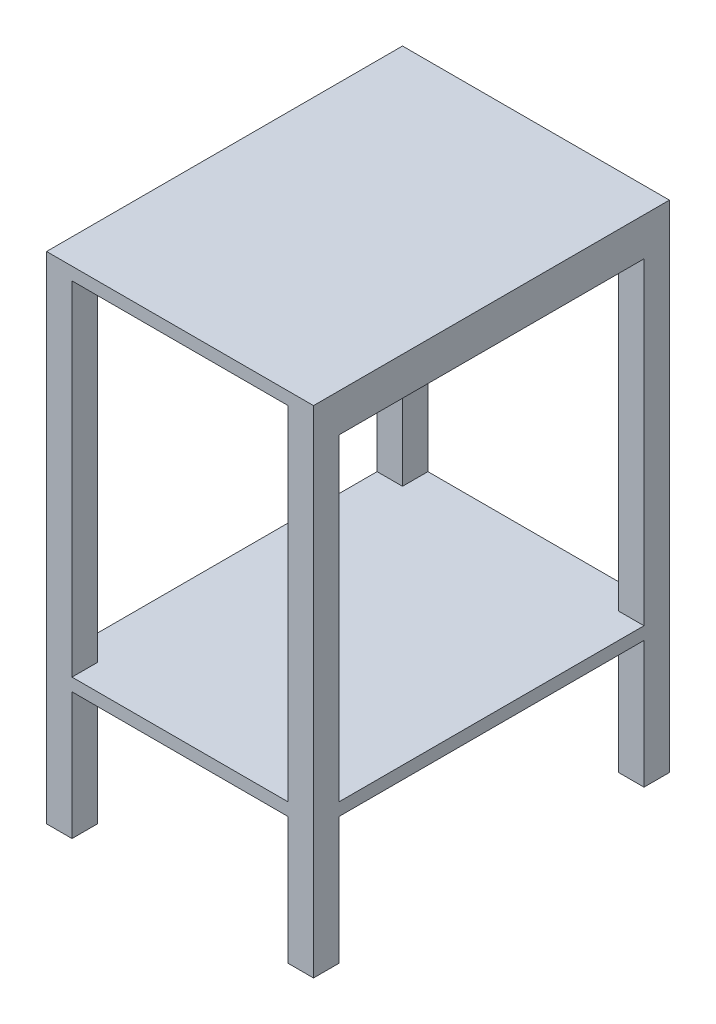
ISO-10303-21;
HEADER;
FILE_DESCRIPTION(('STEP AP214'),'2;1');
FILE_NAME('part.step','',(''),(''),'','','');
FILE_SCHEMA(('AUTOMOTIVE_DESIGN { 1 0 10303 214 1 1 1 1 }'));
ENDSEC;
DATA;
#1=APPLICATION_CONTEXT('core data for automotive mechanical design processes');
#2=APPLICATION_PROTOCOL_DEFINITION('international standard','automotive_design',2000,#1);
#3=PRODUCT_CONTEXT('',#1,'mechanical');
#4=PRODUCT('Part','Part','',(#3));
#5=PRODUCT_RELATED_PRODUCT_CATEGORY('part','',(#4));
#6=PRODUCT_DEFINITION_FORMATION('','',#4);
#7=PRODUCT_DEFINITION_CONTEXT('part definition',#1,'design');
#8=PRODUCT_DEFINITION('design','',#6,#7);
#9=PRODUCT_DEFINITION_SHAPE('','',#8);
#10=(LENGTH_UNIT() NAMED_UNIT(*) SI_UNIT(.MILLI.,.METRE.));
#11=(NAMED_UNIT(*) PLANE_ANGLE_UNIT() SI_UNIT($,.RADIAN.));
#12=(NAMED_UNIT(*) SI_UNIT($,.STERADIAN.) SOLID_ANGLE_UNIT());
#13=UNCERTAINTY_MEASURE_WITH_UNIT(LENGTH_MEASURE(1.E-05),#10,'distance_accuracy_value','');
#14=(GEOMETRIC_REPRESENTATION_CONTEXT(3) GLOBAL_UNCERTAINTY_ASSIGNED_CONTEXT((#13)) GLOBAL_UNIT_ASSIGNED_CONTEXT((#10,
#11,#12)) REPRESENTATION_CONTEXT('',''));
#15=CARTESIAN_POINT('',(0.,0.,0.));
#16=DIRECTION('',(0.,0.,1.));
#17=DIRECTION('',(1.,0.,0.));
#18=AXIS2_PLACEMENT_3D('',#15,#16,#17);
#19=CARTESIAN_POINT('',(0.,0.,0.));
#20=DIRECTION('',(0.,-1.,0.));
#21=DIRECTION('',(0.,0.,-1.));
#22=AXIS2_PLACEMENT_3D('',#19,#20,#21);
#23=PLANE('',#22);
#24=DIRECTION('',(0.,0.,1.));
#25=VECTOR('',#24,1.);
#26=CARTESIAN_POINT('',(85.0000000000001,0.,-160.));
#27=LINE('',#26,#25);
#28=CARTESIAN_POINT('',(85.0000000000001,0.,-140.));
#29=VERTEX_POINT('',#28);
#30=CARTESIAN_POINT('',(85.0000000000001,0.,-120.));
#31=VERTEX_POINT('',#30);
#32=EDGE_CURVE('E262',#29,#31,#27,.T.);
#33=ORIENTED_EDGE('',*,*,#32,.F.);
#34=DIRECTION('',(-1.,0.,0.));
#35=VECTOR('',#34,1.);
#36=CARTESIAN_POINT('',(-105.,0.,-140.));
#37=LINE('',#36,#35);
#38=CARTESIAN_POINT('',(105.,0.,-140.));
#39=VERTEX_POINT('',#38);
#40=EDGE_CURVE('E433',#39,#29,#37,.T.);
#41=ORIENTED_EDGE('',*,*,#40,.F.);
#42=DIRECTION('',(0.,0.,-1.));
#43=VECTOR('',#42,1.);
#44=CARTESIAN_POINT('',(105.,0.,140.));
#45=LINE('',#44,#43);
#46=CARTESIAN_POINT('',(105.,0.,-120.));
#47=VERTEX_POINT('',#46);
#48=EDGE_CURVE('E412',#47,#39,#45,.T.);
#49=ORIENTED_EDGE('',*,*,#48,.F.);
#50=DIRECTION('',(1.,0.,0.));
#51=VECTOR('',#50,1.);
#52=CARTESIAN_POINT('',(0.,0.,-120.));
#53=LINE('',#52,#51);
#54=EDGE_CURVE('E465',#31,#47,#53,.T.);
#55=ORIENTED_EDGE('',*,*,#54,.F.);
#56=EDGE_LOOP('',(#33,#41,#49,#55));
#57=FACE_BOUND('',#56,.T.);
#58=ADVANCED_FACE('F43',(#57),#23,.T.);
#59=CARTESIAN_POINT('',(85.0000000000001,0.,120.));
#60=VERTEX_POINT('',#59);
#61=CARTESIAN_POINT('',(85.0000000000001,0.,140.));
#62=VERTEX_POINT('',#61);
#63=EDGE_CURVE('E248',#60,#62,#27,.T.);
#64=ORIENTED_EDGE('',*,*,#63,.F.);
#65=DIRECTION('',(-1.,0.,0.));
#66=VECTOR('',#65,1.);
#67=CARTESIAN_POINT('',(0.,0.,120.));
#68=LINE('',#67,#66);
#69=CARTESIAN_POINT('',(105.,0.,120.));
#70=VERTEX_POINT('',#69);
#71=EDGE_CURVE('E461',#70,#60,#68,.T.);
#72=ORIENTED_EDGE('',*,*,#71,.F.);
#73=CARTESIAN_POINT('',(105.,0.,140.));
#74=VERTEX_POINT('',#73);
#75=EDGE_CURVE('E428',#74,#70,#45,.T.);
#76=ORIENTED_EDGE('',*,*,#75,.F.);
#77=DIRECTION('',(1.,0.,0.));
#78=VECTOR('',#77,1.);
#79=CARTESIAN_POINT('',(-105.,0.,140.));
#80=LINE('',#79,#78);
#81=EDGE_CURVE('E442',#62,#74,#80,.T.);
#82=ORIENTED_EDGE('',*,*,#81,.F.);
#83=EDGE_LOOP('',(#64,#72,#76,#82));
#84=FACE_BOUND('',#83,.T.);
#85=ADVANCED_FACE('F546',(#84),#23,.T.);
#86=CARTESIAN_POINT('',(-195.,0.,-120.));
#87=DIRECTION('',(0.,0.,-1.));
#88=DIRECTION('',(-1.,0.,0.));
#89=AXIS2_PLACEMENT_3D('',#86,#87,#88);
#90=PLANE('',#89);
#91=DIRECTION('',(1.,0.,0.));
#92=VECTOR('',#91,1.);
#93=CARTESIAN_POINT('',(-195.,100.,-120.));
#94=LINE('',#93,#92);
#95=CARTESIAN_POINT('',(85.0000000000001,100.,-120.));
#96=VERTEX_POINT('',#95);
#97=CARTESIAN_POINT('',(105.,100.,-120.));
#98=VERTEX_POINT('',#97);
#99=EDGE_CURVE('E362',#96,#98,#94,.T.);
#100=ORIENTED_EDGE('',*,*,#99,.F.);
#101=DIRECTION('',(0.,-1.,0.));
#102=VECTOR('',#101,1.);
#103=CARTESIAN_POINT('',(85.0000000000001,0.,-120.));
#104=LINE('',#103,#102);
#105=EDGE_CURVE('E338',#96,#31,#104,.T.);
#106=ORIENTED_EDGE('',*,*,#105,.T.);
#107=ORIENTED_EDGE('',*,*,#54,.T.);
#108=DIRECTION('',(0.,1.,0.));
#109=VECTOR('',#108,1.);
#110=CARTESIAN_POINT('',(105.,0.,-120.));
#111=LINE('',#110,#109);
#112=EDGE_CURVE('E351',#47,#98,#111,.T.);
#113=ORIENTED_EDGE('',*,*,#112,.T.);
#114=EDGE_LOOP('',(#100,#106,#107,#113));
#115=FACE_BOUND('',#114,.T.);
#116=ADVANCED_FACE('F535',(#115),#90,.F.);
#117=CARTESIAN_POINT('',(-195.,0.,120.));
#118=DIRECTION('',(0.,0.,1.));
#119=DIRECTION('',(1.,0.,0.));
#120=AXIS2_PLACEMENT_3D('',#117,#118,#119);
#121=PLANE('',#120);
#122=ORIENTED_EDGE('',*,*,#71,.T.);
#123=DIRECTION('',(0.,1.,0.));
#124=VECTOR('',#123,1.);
#125=CARTESIAN_POINT('',(85.0000000000001,0.,120.));
#126=LINE('',#125,#124);
#127=CARTESIAN_POINT('',(85.0000000000001,100.,120.));
#128=VERTEX_POINT('',#127);
#129=EDGE_CURVE('E11',#60,#128,#126,.T.);
#130=ORIENTED_EDGE('',*,*,#129,.T.);
#131=DIRECTION('',(1.,0.,0.));
#132=VECTOR('',#131,1.);
#133=CARTESIAN_POINT('',(-195.,100.,120.));
#134=LINE('',#133,#132);
#135=CARTESIAN_POINT('',(105.,100.,120.));
#136=VERTEX_POINT('',#135);
#137=EDGE_CURVE('E238',#128,#136,#134,.T.);
#138=ORIENTED_EDGE('',*,*,#137,.T.);
#139=DIRECTION('',(0.,-1.,0.));
#140=VECTOR('',#139,1.);
#141=CARTESIAN_POINT('',(105.,0.,120.));
#142=LINE('',#141,#140);
#143=EDGE_CURVE('E359',#136,#70,#142,.T.);
#144=ORIENTED_EDGE('',*,*,#143,.T.);
#145=EDGE_LOOP('',(#122,#130,#138,#144));
#146=FACE_BOUND('',#145,.T.);
#147=ADVANCED_FACE('F544',(#146),#121,.F.);
#148=CARTESIAN_POINT('',(-195.,110.,-120.));
#149=DIRECTION('',(0.,0.,-1.));
#150=DIRECTION('',(0.,1.,0.));
#151=AXIS2_PLACEMENT_3D('',#148,#149,#150);
#152=PLANE('',#151);
#153=DIRECTION('',(1.,0.,0.));
#154=VECTOR('',#153,1.);
#155=CARTESIAN_POINT('',(-195.,360.,-120.));
#156=LINE('',#155,#154);
#157=CARTESIAN_POINT('',(85.,360.,-120.));
#158=VERTEX_POINT('',#157);
#159=CARTESIAN_POINT('',(105.,360.,-120.));
#160=VERTEX_POINT('',#159);
#161=EDGE_CURVE('E376',#158,#160,#156,.T.);
#162=ORIENTED_EDGE('',*,*,#161,.F.);
#163=DIRECTION('',(0.,-1.,0.));
#164=VECTOR('',#163,1.);
#165=CARTESIAN_POINT('',(85.,110.,-120.));
#166=LINE('',#165,#164);
#167=CARTESIAN_POINT('',(85.,110.,-120.));
#168=VERTEX_POINT('',#167);
#169=EDGE_CURVE('E314',#158,#168,#166,.T.);
#170=ORIENTED_EDGE('',*,*,#169,.T.);
#171=DIRECTION('',(1.,0.,0.));
#172=VECTOR('',#171,1.);
#173=CARTESIAN_POINT('',(-195.,110.,-120.));
#174=LINE('',#173,#172);
#175=CARTESIAN_POINT('',(105.,110.,-120.));
#176=VERTEX_POINT('',#175);
#177=EDGE_CURVE('E350',#168,#176,#174,.T.);
#178=ORIENTED_EDGE('',*,*,#177,.T.);
#179=DIRECTION('',(0.,1.,0.));
#180=VECTOR('',#179,1.);
#181=CARTESIAN_POINT('',(105.,110.,-120.));
#182=LINE('',#181,#180);
#183=EDGE_CURVE('E356',#176,#160,#182,.T.);
#184=ORIENTED_EDGE('',*,*,#183,.T.);
#185=EDGE_LOOP('',(#162,#170,#178,#184));
#186=FACE_BOUND('',#185,.T.);
#187=ADVANCED_FACE('F623',(#186),#152,.F.);
#188=CARTESIAN_POINT('',(-195.,110.,120.));
#189=DIRECTION('',(0.,0.,1.));
#190=DIRECTION('',(1.,0.,0.));
#191=AXIS2_PLACEMENT_3D('',#188,#189,#190);
#192=PLANE('',#191);
#193=DIRECTION('',(1.,0.,0.));
#194=VECTOR('',#193,1.);
#195=CARTESIAN_POINT('',(-195.,110.,120.));
#196=LINE('',#195,#194);
#197=CARTESIAN_POINT('',(85.,110.,120.));
#198=VERTEX_POINT('',#197);
#199=CARTESIAN_POINT('',(105.,110.,120.));
#200=VERTEX_POINT('',#199);
#201=EDGE_CURVE('E386',#198,#200,#196,.T.);
#202=ORIENTED_EDGE('',*,*,#201,.F.);
#203=DIRECTION('',(0.,1.,0.));
#204=VECTOR('',#203,1.);
#205=CARTESIAN_POINT('',(85.,110.,120.));
#206=LINE('',#205,#204);
#207=CARTESIAN_POINT('',(85.,360.,120.));
#208=VERTEX_POINT('',#207);
#209=EDGE_CURVE('E310',#198,#208,#206,.T.);
#210=ORIENTED_EDGE('',*,*,#209,.T.);
#211=DIRECTION('',(1.,0.,0.));
#212=VECTOR('',#211,1.);
#213=CARTESIAN_POINT('',(-195.,360.,120.));
#214=LINE('',#213,#212);
#215=CARTESIAN_POINT('',(105.,360.,120.));
#216=VERTEX_POINT('',#215);
#217=EDGE_CURVE('E381',#208,#216,#214,.T.);
#218=ORIENTED_EDGE('',*,*,#217,.T.);
#219=DIRECTION('',(0.,-1.,0.));
#220=VECTOR('',#219,1.);
#221=CARTESIAN_POINT('',(105.,110.,120.));
#222=LINE('',#221,#220);
#223=EDGE_CURVE('E394',#216,#200,#222,.T.);
#224=ORIENTED_EDGE('',*,*,#223,.T.);
#225=EDGE_LOOP('',(#202,#210,#218,#224));
#226=FACE_BOUND('',#225,.T.);
#227=ADVANCED_FACE('F600',(#226),#192,.F.);
#228=CARTESIAN_POINT('',(-195.,360.,120.));
#229=DIRECTION('',(0.,1.,0.));
#230=DIRECTION('',(0.,0.,1.));
#231=AXIS2_PLACEMENT_3D('',#228,#229,#230);
#232=PLANE('',#231);
#233=ORIENTED_EDGE('',*,*,#217,.F.);
#234=DIRECTION('',(0.,0.,-1.));
#235=VECTOR('',#234,1.);
#236=CARTESIAN_POINT('',(85.,360.,120.));
#237=LINE('',#236,#235);
#238=EDGE_CURVE('E494',#208,#158,#237,.T.);
#239=ORIENTED_EDGE('',*,*,#238,.T.);
#240=ORIENTED_EDGE('',*,*,#161,.T.);
#241=DIRECTION('',(0.,0.,1.));
#242=VECTOR('',#241,1.);
#243=CARTESIAN_POINT('',(105.,360.,120.));
#244=LINE('',#243,#242);
#245=EDGE_CURVE('E398',#160,#216,#244,.T.);
#246=ORIENTED_EDGE('',*,*,#245,.T.);
#247=EDGE_LOOP('',(#233,#239,#240,#246));
#248=FACE_BOUND('',#247,.T.);
#249=ADVANCED_FACE('F592',(#248),#232,.F.);
#250=DIRECTION('',(0.,0.,1.));
#251=VECTOR('',#250,1.);
#252=CARTESIAN_POINT('',(-85.0000000000001,0.,-160.));
#253=LINE('',#252,#251);
#254=CARTESIAN_POINT('',(-85.0000000000001,0.,-140.));
#255=VERTEX_POINT('',#254);
#256=CARTESIAN_POINT('',(-85.0000000000001,0.,-120.));
#257=VERTEX_POINT('',#256);
#258=EDGE_CURVE('E263',#255,#257,#253,.T.);
#259=ORIENTED_EDGE('',*,*,#258,.T.);
#260=CARTESIAN_POINT('',(-105.,0.,-120.));
#261=VERTEX_POINT('',#260);
#262=EDGE_CURVE('E466',#261,#257,#53,.T.);
#263=ORIENTED_EDGE('',*,*,#262,.F.);
#264=DIRECTION('',(0.,0.,1.));
#265=VECTOR('',#264,1.);
#266=CARTESIAN_POINT('',(-105.,0.,140.));
#267=LINE('',#266,#265);
#268=CARTESIAN_POINT('',(-105.,0.,-140.));
#269=VERTEX_POINT('',#268);
#270=EDGE_CURVE('E438',#269,#261,#267,.T.);
#271=ORIENTED_EDGE('',*,*,#270,.F.);
#272=EDGE_CURVE('E432',#255,#269,#37,.T.);
#273=ORIENTED_EDGE('',*,*,#272,.F.);
#274=EDGE_LOOP('',(#259,#263,#271,#273));
#275=FACE_BOUND('',#274,.T.);
#276=ADVANCED_FACE('F581',(#275),#23,.T.);
#277=CARTESIAN_POINT('',(105.,390.,140.));
#278=DIRECTION('',(-1.,0.,0.));
#279=DIRECTION('',(0.,0.,1.));
#280=AXIS2_PLACEMENT_3D('',#277,#278,#279);
#281=PLANE('',#280);
#282=ORIENTED_EDGE('',*,*,#245,.F.);
#283=ORIENTED_EDGE('',*,*,#183,.F.);
#284=DIRECTION('',(0.,0.,-1.));
#285=VECTOR('',#284,1.);
#286=CARTESIAN_POINT('',(105.,110.,120.));
#287=LINE('',#286,#285);
#288=EDGE_CURVE('E375',#200,#176,#287,.T.);
#289=ORIENTED_EDGE('',*,*,#288,.F.);
#290=ORIENTED_EDGE('',*,*,#223,.F.);
#291=EDGE_LOOP('',(#282,#283,#289,#290));
#292=FACE_BOUND('',#291,.T.);
#293=DIRECTION('',(0.,0.,1.));
#294=VECTOR('',#293,1.);
#295=CARTESIAN_POINT('',(105.,100.,120.));
#296=LINE('',#295,#294);
#297=EDGE_CURVE('E355',#98,#136,#296,.T.);
#298=ORIENTED_EDGE('',*,*,#297,.F.);
#299=ORIENTED_EDGE('',*,*,#112,.F.);
#300=ORIENTED_EDGE('',*,*,#48,.T.);
#301=DIRECTION('',(0.,-1.,0.));
#302=VECTOR('',#301,1.);
#303=CARTESIAN_POINT('',(105.,390.,-140.));
#304=LINE('',#303,#302);
#305=CARTESIAN_POINT('',(105.,390.,-140.));
#306=VERTEX_POINT('',#305);
#307=EDGE_CURVE('E456',#306,#39,#304,.T.);
#308=ORIENTED_EDGE('',*,*,#307,.F.);
#309=DIRECTION('',(0.,0.,-1.));
#310=VECTOR('',#309,1.);
#311=CARTESIAN_POINT('',(105.,390.,140.));
#312=LINE('',#311,#310);
#313=CARTESIAN_POINT('',(105.,390.,140.));
#314=VERTEX_POINT('',#313);
#315=EDGE_CURVE('E413',#314,#306,#312,.T.);
#316=ORIENTED_EDGE('',*,*,#315,.F.);
#317=DIRECTION('',(0.,-1.,0.));
#318=VECTOR('',#317,1.);
#319=CARTESIAN_POINT('',(105.,390.,140.));
#320=LINE('',#319,#318);
#321=EDGE_CURVE('E427',#314,#74,#320,.T.);
#322=ORIENTED_EDGE('',*,*,#321,.T.);
#323=ORIENTED_EDGE('',*,*,#75,.T.);
#324=ORIENTED_EDGE('',*,*,#143,.F.);
#325=EDGE_LOOP('',(#298,#299,#300,#308,#316,#322,#323,#324));
#326=FACE_BOUND('',#325,.T.);
#327=ADVANCED_FACE('F45',(#292,#326),#281,.F.);
#328=CARTESIAN_POINT('',(-105.,390.,-140.));
#329=DIRECTION('',(0.,0.,1.));
#330=DIRECTION('',(1.,0.,0.));
#331=AXIS2_PLACEMENT_3D('',#328,#329,#330);
#332=PLANE('',#331);
#333=ORIENTED_EDGE('',*,*,#40,.T.);
#334=DIRECTION('',(0.,1.,0.));
#335=VECTOR('',#334,1.);
#336=CARTESIAN_POINT('',(85.0000000000001,390.,-140.));
#337=LINE('',#336,#335);
#338=CARTESIAN_POINT('',(85.0000000000001,100.,-140.));
#339=VERTEX_POINT('',#338);
#340=EDGE_CURVE('E342',#29,#339,#337,.T.);
#341=ORIENTED_EDGE('',*,*,#340,.T.);
#342=DIRECTION('',(-1.,0.,0.));
#343=VECTOR('',#342,1.);
#344=CARTESIAN_POINT('',(-105.,100.,-140.));
#345=LINE('',#344,#343);
#346=CARTESIAN_POINT('',(-85.0000000000001,100.,-140.));
#347=VERTEX_POINT('',#346);
#348=EDGE_CURVE('E326',#339,#347,#345,.T.);
#349=ORIENTED_EDGE('',*,*,#348,.T.);
#350=DIRECTION('',(0.,-1.,0.));
#351=VECTOR('',#350,1.);
#352=CARTESIAN_POINT('',(-85.0000000000001,390.,-140.));
#353=LINE('',#352,#351);
#354=EDGE_CURVE('E334',#347,#255,#353,.T.);
#355=ORIENTED_EDGE('',*,*,#354,.T.);
#356=ORIENTED_EDGE('',*,*,#272,.T.);
#357=DIRECTION('',(0.,-1.,0.));
#358=VECTOR('',#357,1.);
#359=CARTESIAN_POINT('',(-105.,390.,-140.));
#360=LINE('',#359,#358);
#361=CARTESIAN_POINT('',(-105.,390.,-140.));
#362=VERTEX_POINT('',#361);
#363=EDGE_CURVE('E452',#362,#269,#360,.T.);
#364=ORIENTED_EDGE('',*,*,#363,.F.);
#365=DIRECTION('',(-1.,0.,0.));
#366=VECTOR('',#365,1.);
#367=CARTESIAN_POINT('',(-105.,390.,-140.));
#368=LINE('',#367,#366);
#369=EDGE_CURVE('E417',#306,#362,#368,.T.);
#370=ORIENTED_EDGE('',*,*,#369,.F.);
#371=ORIENTED_EDGE('',*,*,#307,.T.);
#372=EDGE_LOOP('',(#333,#341,#349,#355,#356,#364,#370,#371));
#373=FACE_BOUND('',#372,.T.);
#374=DIRECTION('',(1.,0.,0.));
#375=VECTOR('',#374,1.);
#376=CARTESIAN_POINT('',(-105.,110.,-140.));
#377=LINE('',#376,#375);
#378=CARTESIAN_POINT('',(-85.0000000000001,110.,-140.));
#379=VERTEX_POINT('',#378);
#380=CARTESIAN_POINT('',(85.,110.,-140.));
#381=VERTEX_POINT('',#380);
#382=EDGE_CURVE('E322',#379,#381,#377,.T.);
#383=ORIENTED_EDGE('',*,*,#382,.T.);
#384=DIRECTION('',(0.,1.,0.));
#385=VECTOR('',#384,1.);
#386=CARTESIAN_POINT('',(85.,390.,-140.));
#387=LINE('',#386,#385);
#388=CARTESIAN_POINT('',(85.,380.,-140.));
#389=VERTEX_POINT('',#388);
#390=EDGE_CURVE('E318',#381,#389,#387,.T.);
#391=ORIENTED_EDGE('',*,*,#390,.T.);
#392=DIRECTION('',(-1.,0.,0.));
#393=VECTOR('',#392,1.);
#394=CARTESIAN_POINT('',(-105.,380.,-140.));
#395=LINE('',#394,#393);
#396=CARTESIAN_POINT('',(-85.0000000000001,380.,-140.));
#397=VERTEX_POINT('',#396);
#398=EDGE_CURVE('E346',#389,#397,#395,.T.);
#399=ORIENTED_EDGE('',*,*,#398,.T.);
#400=DIRECTION('',(0.,-1.,0.));
#401=VECTOR('',#400,1.);
#402=CARTESIAN_POINT('',(-85.0000000000001,390.,-140.));
#403=LINE('',#402,#401);
#404=EDGE_CURVE('E306',#397,#379,#403,.T.);
#405=ORIENTED_EDGE('',*,*,#404,.T.);
#406=EDGE_LOOP('',(#383,#391,#399,#405));
#407=FACE_BOUND('',#406,.T.);
#408=ADVANCED_FACE('F598',(#373,#407),#332,.F.);
#409=CARTESIAN_POINT('',(-105.,390.,140.));
#410=DIRECTION('',(1.,0.,0.));
#411=DIRECTION('',(0.,0.,-1.));
#412=AXIS2_PLACEMENT_3D('',#409,#410,#411);
#413=PLANE('',#412);
#414=ORIENTED_EDGE('',*,*,#270,.T.);
#415=DIRECTION('',(0.,1.,0.));
#416=VECTOR('',#415,1.);
#417=CARTESIAN_POINT('',(-105.,390.,-120.));
#418=LINE('',#417,#416);
#419=CARTESIAN_POINT('',(-105.,100.,-120.));
#420=VERTEX_POINT('',#419);
#421=EDGE_CURVE('E408',#261,#420,#418,.T.);
#422=ORIENTED_EDGE('',*,*,#421,.T.);
#423=DIRECTION('',(0.,0.,1.));
#424=VECTOR('',#423,1.);
#425=CARTESIAN_POINT('',(-105.,100.,140.));
#426=LINE('',#425,#424);
#427=CARTESIAN_POINT('',(-105.,100.,120.));
#428=VERTEX_POINT('',#427);
#429=EDGE_CURVE('E486',#420,#428,#426,.T.);
#430=ORIENTED_EDGE('',*,*,#429,.T.);
#431=DIRECTION('',(0.,-1.,0.));
#432=VECTOR('',#431,1.);
#433=CARTESIAN_POINT('',(-105.,390.,120.));
#434=LINE('',#433,#432);
#435=CARTESIAN_POINT('',(-105.,0.,120.));
#436=VERTEX_POINT('',#435);
#437=EDGE_CURVE('E367',#428,#436,#434,.T.);
#438=ORIENTED_EDGE('',*,*,#437,.T.);
#439=CARTESIAN_POINT('',(-105.,0.,140.));
#440=VERTEX_POINT('',#439);
#441=EDGE_CURVE('E437',#436,#440,#267,.T.);
#442=ORIENTED_EDGE('',*,*,#441,.T.);
#443=DIRECTION('',(0.,-1.,0.));
#444=VECTOR('',#443,1.);
#445=CARTESIAN_POINT('',(-105.,390.,140.));
#446=LINE('',#445,#444);
#447=CARTESIAN_POINT('',(-105.,390.,140.));
#448=VERTEX_POINT('',#447);
#449=EDGE_CURVE('E448',#448,#440,#446,.T.);
#450=ORIENTED_EDGE('',*,*,#449,.F.);
#451=DIRECTION('',(0.,0.,1.));
#452=VECTOR('',#451,1.);
#453=CARTESIAN_POINT('',(-105.,390.,140.));
#454=LINE('',#453,#452);
#455=EDGE_CURVE('E421',#362,#448,#454,.T.);
#456=ORIENTED_EDGE('',*,*,#455,.F.);
#457=ORIENTED_EDGE('',*,*,#363,.T.);
#458=EDGE_LOOP('',(#414,#422,#430,#438,#442,#450,#456,#457));
#459=FACE_BOUND('',#458,.T.);
#460=DIRECTION('',(0.,0.,-1.));
#461=VECTOR('',#460,1.);
#462=CARTESIAN_POINT('',(-105.,110.,140.));
#463=LINE('',#462,#461);
#464=CARTESIAN_POINT('',(-105.,110.,120.));
#465=VERTEX_POINT('',#464);
#466=CARTESIAN_POINT('',(-105.,110.,-120.));
#467=VERTEX_POINT('',#466);
#468=EDGE_CURVE('E478',#465,#467,#463,.T.);
#469=ORIENTED_EDGE('',*,*,#468,.T.);
#470=DIRECTION('',(0.,1.,0.));
#471=VECTOR('',#470,1.);
#472=CARTESIAN_POINT('',(-105.,390.,-120.));
#473=LINE('',#472,#471);
#474=CARTESIAN_POINT('',(-105.,360.,-120.));
#475=VERTEX_POINT('',#474);
#476=EDGE_CURVE('E482',#467,#475,#473,.T.);
#477=ORIENTED_EDGE('',*,*,#476,.T.);
#478=DIRECTION('',(0.,0.,1.));
#479=VECTOR('',#478,1.);
#480=CARTESIAN_POINT('',(-105.,360.,140.));
#481=LINE('',#480,#479);
#482=CARTESIAN_POINT('',(-105.,360.,120.));
#483=VERTEX_POINT('',#482);
#484=EDGE_CURVE('E470',#475,#483,#481,.T.);
#485=ORIENTED_EDGE('',*,*,#484,.T.);
#486=DIRECTION('',(0.,-1.,0.));
#487=VECTOR('',#486,1.);
#488=CARTESIAN_POINT('',(-105.,390.,120.));
#489=LINE('',#488,#487);
#490=EDGE_CURVE('E474',#483,#465,#489,.T.);
#491=ORIENTED_EDGE('',*,*,#490,.T.);
#492=EDGE_LOOP('',(#469,#477,#485,#491));
#493=FACE_BOUND('',#492,.T.);
#494=ADVANCED_FACE('F557',(#459,#493),#413,.F.);
#495=CARTESIAN_POINT('',(-105.,390.,140.));
#496=DIRECTION('',(0.,0.,-1.));
#497=DIRECTION('',(-1.,0.,0.));
#498=AXIS2_PLACEMENT_3D('',#495,#496,#497);
#499=PLANE('',#498);
#500=DIRECTION('',(-1.,0.,0.));
#501=VECTOR('',#500,1.);
#502=CARTESIAN_POINT('',(-85.0000000000001,380.,140.));
#503=LINE('',#502,#501);
#504=CARTESIAN_POINT('',(85.,380.,140.));
#505=VERTEX_POINT('',#504);
#506=CARTESIAN_POINT('',(-85.0000000000001,380.,140.));
#507=VERTEX_POINT('',#506);
#508=EDGE_CURVE('E293',#505,#507,#503,.T.);
#509=ORIENTED_EDGE('',*,*,#508,.F.);
#510=DIRECTION('',(0.,1.,0.));
#511=VECTOR('',#510,1.);
#512=CARTESIAN_POINT('',(85.,110.,140.));
#513=LINE('',#512,#511);
#514=CARTESIAN_POINT('',(85.,110.,140.));
#515=VERTEX_POINT('',#514);
#516=EDGE_CURVE('E67',#515,#505,#513,.T.);
#517=ORIENTED_EDGE('',*,*,#516,.F.);
#518=DIRECTION('',(1.,0.,0.));
#519=VECTOR('',#518,1.);
#520=CARTESIAN_POINT('',(-85.0000000000001,110.,140.));
#521=LINE('',#520,#519);
#522=CARTESIAN_POINT('',(-85.0000000000001,110.,140.));
#523=VERTEX_POINT('',#522);
#524=EDGE_CURVE('E275',#523,#515,#521,.T.);
#525=ORIENTED_EDGE('',*,*,#524,.F.);
#526=DIRECTION('',(0.,-1.,0.));
#527=VECTOR('',#526,1.);
#528=CARTESIAN_POINT('',(-85.0000000000001,110.,140.));
#529=LINE('',#528,#527);
#530=EDGE_CURVE('E289',#507,#523,#529,.T.);
#531=ORIENTED_EDGE('',*,*,#530,.F.);
#532=EDGE_LOOP('',(#509,#517,#525,#531));
#533=FACE_BOUND('',#532,.T.);
#534=DIRECTION('',(-1.,0.,0.));
#535=VECTOR('',#534,1.);
#536=CARTESIAN_POINT('',(-85.0000000000001,100.,140.));
#537=LINE('',#536,#535);
#538=CARTESIAN_POINT('',(85.0000000000001,100.,140.));
#539=VERTEX_POINT('',#538);
#540=CARTESIAN_POINT('',(-85.0000000000001,100.,140.));
#541=VERTEX_POINT('',#540);
#542=EDGE_CURVE('E235',#539,#541,#537,.T.);
#543=ORIENTED_EDGE('',*,*,#542,.F.);
#544=DIRECTION('',(0.,1.,0.));
#545=VECTOR('',#544,1.);
#546=CARTESIAN_POINT('',(85.0000000000001,0.,140.));
#547=LINE('',#546,#545);
#548=EDGE_CURVE('E245',#62,#539,#547,.T.);
#549=ORIENTED_EDGE('',*,*,#548,.F.);
#550=ORIENTED_EDGE('',*,*,#81,.T.);
#551=ORIENTED_EDGE('',*,*,#321,.F.);
#552=DIRECTION('',(1.,0.,0.));
#553=VECTOR('',#552,1.);
#554=CARTESIAN_POINT('',(-105.,390.,140.));
#555=LINE('',#554,#553);
#556=EDGE_CURVE('E424',#448,#314,#555,.T.);
#557=ORIENTED_EDGE('',*,*,#556,.F.);
#558=ORIENTED_EDGE('',*,*,#449,.T.);
#559=CARTESIAN_POINT('',(-85.0000000000001,0.,140.));
#560=VERTEX_POINT('',#559);
#561=EDGE_CURVE('E418',#440,#560,#80,.T.);
#562=ORIENTED_EDGE('',*,*,#561,.T.);
#563=DIRECTION('',(0.,-1.,0.));
#564=VECTOR('',#563,1.);
#565=CARTESIAN_POINT('',(-85.0000000000001,0.,140.));
#566=LINE('',#565,#564);
#567=EDGE_CURVE('E242',#541,#560,#566,.T.);
#568=ORIENTED_EDGE('',*,*,#567,.F.);
#569=EDGE_LOOP('',(#543,#549,#550,#551,#557,#558,#562,#568));
#570=FACE_BOUND('',#569,.T.);
#571=ADVANCED_FACE('F253',(#533,#570),#499,.F.);
#572=CARTESIAN_POINT('',(0.,390.,0.));
#573=DIRECTION('',(0.,-1.,0.));
#574=DIRECTION('',(0.,0.,-1.));
#575=AXIS2_PLACEMENT_3D('',#572,#573,#574);
#576=PLANE('',#575);
#577=ORIENTED_EDGE('',*,*,#315,.T.);
#578=ORIENTED_EDGE('',*,*,#369,.T.);
#579=ORIENTED_EDGE('',*,*,#455,.T.);
#580=ORIENTED_EDGE('',*,*,#556,.T.);
#581=EDGE_LOOP('',(#577,#578,#579,#580));
#582=FACE_BOUND('',#581,.T.);
#583=ADVANCED_FACE('F552',(#582),#576,.F.);
#584=CARTESIAN_POINT('',(-85.0000000000001,0.,120.));
#585=VERTEX_POINT('',#584);
#586=EDGE_CURVE('E264',#585,#560,#253,.T.);
#587=ORIENTED_EDGE('',*,*,#586,.T.);
#588=ORIENTED_EDGE('',*,*,#561,.F.);
#589=ORIENTED_EDGE('',*,*,#441,.F.);
#590=EDGE_CURVE('E460',#585,#436,#68,.T.);
#591=ORIENTED_EDGE('',*,*,#590,.F.);
#592=EDGE_LOOP('',(#587,#588,#589,#591));
#593=FACE_BOUND('',#592,.T.);
#594=ADVANCED_FACE('F507',(#593),#23,.T.);
#595=CARTESIAN_POINT('',(-195.,100.,120.));
#596=DIRECTION('',(0.,1.,0.));
#597=DIRECTION('',(0.,0.,1.));
#598=AXIS2_PLACEMENT_3D('',#595,#596,#597);
#599=PLANE('',#598);
#600=CARTESIAN_POINT('',(-85.0000000000001,100.,-120.));
#601=VERTEX_POINT('',#600);
#602=EDGE_CURVE('E368',#420,#601,#94,.T.);
#603=ORIENTED_EDGE('',*,*,#602,.T.);
#604=DIRECTION('',(0.,0.,1.));
#605=VECTOR('',#604,1.);
#606=CARTESIAN_POINT('',(-85.0000000000001,100.,-160.));
#607=LINE('',#606,#605);
#608=EDGE_CURVE('E268',#347,#601,#607,.T.);
#609=ORIENTED_EDGE('',*,*,#608,.F.);
#610=ORIENTED_EDGE('',*,*,#348,.F.);
#611=DIRECTION('',(0.,0.,1.));
#612=VECTOR('',#611,1.);
#613=CARTESIAN_POINT('',(85.0000000000001,100.,-160.));
#614=LINE('',#613,#612);
#615=EDGE_CURVE('E241',#339,#96,#614,.T.);
#616=ORIENTED_EDGE('',*,*,#615,.T.);
#617=ORIENTED_EDGE('',*,*,#99,.T.);
#618=ORIENTED_EDGE('',*,*,#297,.T.);
#619=ORIENTED_EDGE('',*,*,#137,.F.);
#620=EDGE_CURVE('E230',#128,#539,#614,.T.);
#621=ORIENTED_EDGE('',*,*,#620,.T.);
#622=ORIENTED_EDGE('',*,*,#542,.T.);
#623=CARTESIAN_POINT('',(-85.0000000000001,100.,120.));
#624=VERTEX_POINT('',#623);
#625=EDGE_CURVE('E269',#624,#541,#607,.T.);
#626=ORIENTED_EDGE('',*,*,#625,.F.);
#627=EDGE_CURVE('E363',#428,#624,#134,.T.);
#628=ORIENTED_EDGE('',*,*,#627,.F.);
#629=ORIENTED_EDGE('',*,*,#429,.F.);
#630=EDGE_LOOP('',(#603,#609,#610,#616,#617,#618,#619,#621,#622,#626,#628,#629));
#631=FACE_BOUND('',#630,.T.);
#632=ADVANCED_FACE('F233',(#631),#599,.F.);
#633=ORIENTED_EDGE('',*,*,#262,.T.);
#634=DIRECTION('',(0.,1.,0.));
#635=VECTOR('',#634,1.);
#636=CARTESIAN_POINT('',(-85.0000000000001,0.,-120.));
#637=LINE('',#636,#635);
#638=EDGE_CURVE('E330',#257,#601,#637,.T.);
#639=ORIENTED_EDGE('',*,*,#638,.T.);
#640=ORIENTED_EDGE('',*,*,#602,.F.);
#641=ORIENTED_EDGE('',*,*,#421,.F.);
#642=EDGE_LOOP('',(#633,#639,#640,#641));
#643=FACE_BOUND('',#642,.T.);
#644=ADVANCED_FACE('F589',(#643),#90,.F.);
#645=ORIENTED_EDGE('',*,*,#627,.T.);
#646=DIRECTION('',(0.,-1.,0.));
#647=VECTOR('',#646,1.);
#648=CARTESIAN_POINT('',(-85.0000000000001,0.,120.));
#649=LINE('',#648,#647);
#650=EDGE_CURVE('E52',#624,#585,#649,.T.);
#651=ORIENTED_EDGE('',*,*,#650,.T.);
#652=ORIENTED_EDGE('',*,*,#590,.T.);
#653=ORIENTED_EDGE('',*,*,#437,.F.);
#654=EDGE_LOOP('',(#645,#651,#652,#653));
#655=FACE_BOUND('',#654,.T.);
#656=ADVANCED_FACE('F502',(#655),#121,.F.);
#657=CARTESIAN_POINT('',(-85.0000000000001,110.,-120.));
#658=VERTEX_POINT('',#657);
#659=EDGE_CURVE('E387',#467,#658,#174,.T.);
#660=ORIENTED_EDGE('',*,*,#659,.T.);
#661=DIRECTION('',(0.,1.,0.));
#662=VECTOR('',#661,1.);
#663=CARTESIAN_POINT('',(-85.0000000000001,110.,-120.));
#664=LINE('',#663,#662);
#665=CARTESIAN_POINT('',(-85.0000000000001,360.,-120.));
#666=VERTEX_POINT('',#665);
#667=EDGE_CURVE('E302',#658,#666,#664,.T.);
#668=ORIENTED_EDGE('',*,*,#667,.T.);
#669=EDGE_CURVE('E371',#475,#666,#156,.T.);
#670=ORIENTED_EDGE('',*,*,#669,.F.);
#671=ORIENTED_EDGE('',*,*,#476,.F.);
#672=EDGE_LOOP('',(#660,#668,#670,#671));
#673=FACE_BOUND('',#672,.T.);
#674=ADVANCED_FACE('F639',(#673),#152,.F.);
#675=CARTESIAN_POINT('',(-195.,110.,120.));
#676=DIRECTION('',(0.,-1.,0.));
#677=DIRECTION('',(0.,0.,-1.));
#678=AXIS2_PLACEMENT_3D('',#675,#676,#677);
#679=PLANE('',#678);
#680=CARTESIAN_POINT('',(-85.0000000000001,110.,120.));
#681=VERTEX_POINT('',#680);
#682=EDGE_CURVE('E382',#465,#681,#196,.T.);
#683=ORIENTED_EDGE('',*,*,#682,.T.);
#684=DIRECTION('',(0.,0.,1.));
#685=VECTOR('',#684,1.);
#686=CARTESIAN_POINT('',(-85.0000000000001,110.,-160.));
#687=LINE('',#686,#685);
#688=EDGE_CURVE('E279',#681,#523,#687,.T.);
#689=ORIENTED_EDGE('',*,*,#688,.T.);
#690=ORIENTED_EDGE('',*,*,#524,.T.);
#691=DIRECTION('',(0.,0.,1.));
#692=VECTOR('',#691,1.);
#693=CARTESIAN_POINT('',(85.,110.,-160.));
#694=LINE('',#693,#692);
#695=EDGE_CURVE('E283',#198,#515,#694,.T.);
#696=ORIENTED_EDGE('',*,*,#695,.F.);
#697=ORIENTED_EDGE('',*,*,#201,.T.);
#698=ORIENTED_EDGE('',*,*,#288,.T.);
#699=ORIENTED_EDGE('',*,*,#177,.F.);
#700=EDGE_CURVE('E282',#381,#168,#694,.T.);
#701=ORIENTED_EDGE('',*,*,#700,.F.);
#702=ORIENTED_EDGE('',*,*,#382,.F.);
#703=EDGE_CURVE('E278',#379,#658,#687,.T.);
#704=ORIENTED_EDGE('',*,*,#703,.T.);
#705=ORIENTED_EDGE('',*,*,#659,.F.);
#706=ORIENTED_EDGE('',*,*,#468,.F.);
#707=EDGE_LOOP('',(#683,#689,#690,#696,#697,#698,#699,#701,#702,#704,#705,#706));
#708=FACE_BOUND('',#707,.T.);
#709=ADVANCED_FACE('F616',(#708),#679,.F.);
#710=CARTESIAN_POINT('',(-85.0000000000001,360.,120.));
#711=VERTEX_POINT('',#710);
#712=EDGE_CURVE('E377',#483,#711,#214,.T.);
#713=ORIENTED_EDGE('',*,*,#712,.T.);
#714=DIRECTION('',(0.,-1.,0.));
#715=VECTOR('',#714,1.);
#716=CARTESIAN_POINT('',(-85.0000000000001,110.,120.));
#717=LINE('',#716,#715);
#718=EDGE_CURVE('E298',#711,#681,#717,.T.);
#719=ORIENTED_EDGE('',*,*,#718,.T.);
#720=ORIENTED_EDGE('',*,*,#682,.F.);
#721=ORIENTED_EDGE('',*,*,#490,.F.);
#722=EDGE_LOOP('',(#713,#719,#720,#721));
#723=FACE_BOUND('',#722,.T.);
#724=ADVANCED_FACE('F634',(#723),#192,.F.);
#725=ORIENTED_EDGE('',*,*,#669,.T.);
#726=DIRECTION('',(0.,0.,1.));
#727=VECTOR('',#726,1.);
#728=CARTESIAN_POINT('',(-85.0000000000001,360.,120.));
#729=LINE('',#728,#727);
#730=EDGE_CURVE('E490',#666,#711,#729,.T.);
#731=ORIENTED_EDGE('',*,*,#730,.T.);
#732=ORIENTED_EDGE('',*,*,#712,.F.);
#733=ORIENTED_EDGE('',*,*,#484,.F.);
#734=EDGE_LOOP('',(#725,#731,#732,#733));
#735=FACE_BOUND('',#734,.T.);
#736=ADVANCED_FACE('F603',(#735),#232,.F.);
#737=CARTESIAN_POINT('',(-85.0000000000001,380.,-160.));
#738=DIRECTION('',(0.,1.,0.));
#739=DIRECTION('',(0.,0.,1.));
#740=AXIS2_PLACEMENT_3D('',#737,#738,#739);
#741=PLANE('',#740);
#742=DIRECTION('',(0.,0.,1.));
#743=VECTOR('',#742,1.);
#744=CARTESIAN_POINT('',(85.,380.,-160.));
#745=LINE('',#744,#743);
#746=EDGE_CURVE('E272',#389,#505,#745,.T.);
#747=ORIENTED_EDGE('',*,*,#746,.T.);
#748=ORIENTED_EDGE('',*,*,#508,.T.);
#749=DIRECTION('',(0.,0.,1.));
#750=VECTOR('',#749,1.);
#751=CARTESIAN_POINT('',(-85.0000000000001,380.,-160.));
#752=LINE('',#751,#750);
#753=EDGE_CURVE('E59',#397,#507,#752,.T.);
#754=ORIENTED_EDGE('',*,*,#753,.F.);
#755=ORIENTED_EDGE('',*,*,#398,.F.);
#756=EDGE_LOOP('',(#747,#748,#754,#755));
#757=FACE_BOUND('',#756,.T.);
#758=ADVANCED_FACE('F647',(#757),#741,.F.);
#759=CARTESIAN_POINT('',(85.,110.,-160.));
#760=DIRECTION('',(1.,0.,0.));
#761=DIRECTION('',(0.,0.,-1.));
#762=AXIS2_PLACEMENT_3D('',#759,#760,#761);
#763=PLANE('',#762);
#764=ORIENTED_EDGE('',*,*,#700,.T.);
#765=ORIENTED_EDGE('',*,*,#169,.F.);
#766=ORIENTED_EDGE('',*,*,#238,.F.);
#767=ORIENTED_EDGE('',*,*,#209,.F.);
#768=ORIENTED_EDGE('',*,*,#695,.T.);
#769=ORIENTED_EDGE('',*,*,#516,.T.);
#770=ORIENTED_EDGE('',*,*,#746,.F.);
#771=ORIENTED_EDGE('',*,*,#390,.F.);
#772=EDGE_LOOP('',(#764,#765,#766,#767,#768,#769,#770,#771));
#773=FACE_BOUND('',#772,.T.);
#774=ADVANCED_FACE('F570',(#773),#763,.F.);
#775=CARTESIAN_POINT('',(-85.0000000000001,110.,-160.));
#776=DIRECTION('',(-1.,0.,0.));
#777=DIRECTION('',(0.,0.,1.));
#778=AXIS2_PLACEMENT_3D('',#775,#776,#777);
#779=PLANE('',#778);
#780=ORIENTED_EDGE('',*,*,#753,.T.);
#781=ORIENTED_EDGE('',*,*,#530,.T.);
#782=ORIENTED_EDGE('',*,*,#688,.F.);
#783=ORIENTED_EDGE('',*,*,#718,.F.);
#784=ORIENTED_EDGE('',*,*,#730,.F.);
#785=ORIENTED_EDGE('',*,*,#667,.F.);
#786=ORIENTED_EDGE('',*,*,#703,.F.);
#787=ORIENTED_EDGE('',*,*,#404,.F.);
#788=EDGE_LOOP('',(#780,#781,#782,#783,#784,#785,#786,#787));
#789=FACE_BOUND('',#788,.T.);
#790=ADVANCED_FACE('F562',(#789),#779,.F.);
#791=CARTESIAN_POINT('',(-85.0000000000001,0.,-160.));
#792=DIRECTION('',(-1.,0.,0.));
#793=DIRECTION('',(0.,0.,1.));
#794=AXIS2_PLACEMENT_3D('',#791,#792,#793);
#795=PLANE('',#794);
#796=ORIENTED_EDGE('',*,*,#625,.T.);
#797=ORIENTED_EDGE('',*,*,#567,.T.);
#798=ORIENTED_EDGE('',*,*,#586,.F.);
#799=ORIENTED_EDGE('',*,*,#650,.F.);
#800=EDGE_LOOP('',(#796,#797,#798,#799));
#801=FACE_BOUND('',#800,.T.);
#802=ADVANCED_FACE('F560',(#801),#795,.F.);
#803=CARTESIAN_POINT('',(85.0000000000001,0.,-160.));
#804=DIRECTION('',(1.,0.,0.));
#805=DIRECTION('',(0.,0.,-1.));
#806=AXIS2_PLACEMENT_3D('',#803,#804,#805);
#807=PLANE('',#806);
#808=ORIENTED_EDGE('',*,*,#63,.T.);
#809=ORIENTED_EDGE('',*,*,#548,.T.);
#810=ORIENTED_EDGE('',*,*,#620,.F.);
#811=ORIENTED_EDGE('',*,*,#129,.F.);
#812=EDGE_LOOP('',(#808,#809,#810,#811));
#813=FACE_BOUND('',#812,.T.);
#814=ADVANCED_FACE('F246',(#813),#807,.F.);
#815=ORIENTED_EDGE('',*,*,#32,.T.);
#816=ORIENTED_EDGE('',*,*,#105,.F.);
#817=ORIENTED_EDGE('',*,*,#615,.F.);
#818=ORIENTED_EDGE('',*,*,#340,.F.);
#819=EDGE_LOOP('',(#815,#816,#817,#818));
#820=FACE_BOUND('',#819,.T.);
#821=ADVANCED_FACE('F531',(#820),#807,.F.);
#822=ORIENTED_EDGE('',*,*,#608,.T.);
#823=ORIENTED_EDGE('',*,*,#638,.F.);
#824=ORIENTED_EDGE('',*,*,#258,.F.);
#825=ORIENTED_EDGE('',*,*,#354,.F.);
#826=EDGE_LOOP('',(#822,#823,#824,#825));
#827=FACE_BOUND('',#826,.T.);
#828=ADVANCED_FACE('F564',(#827),#795,.F.);
#829=CLOSED_SHELL('',(#58,#85,#116,#147,#187,#227,#249,#276,#327,#408,#494,#571,#583,#594,#632,
#644,#656,#674,#709,#724,#736,#758,#774,#790,#802,#814,#821,#828));
#830=MANIFOLD_SOLID_BREP('B2',#829);
#831=ADVANCED_BREP_SHAPE_REPRESENTATION('',(#18,#830),#14);
#832=SHAPE_DEFINITION_REPRESENTATION(#9,#831);
ENDSEC;
END-ISO-10303-21;
